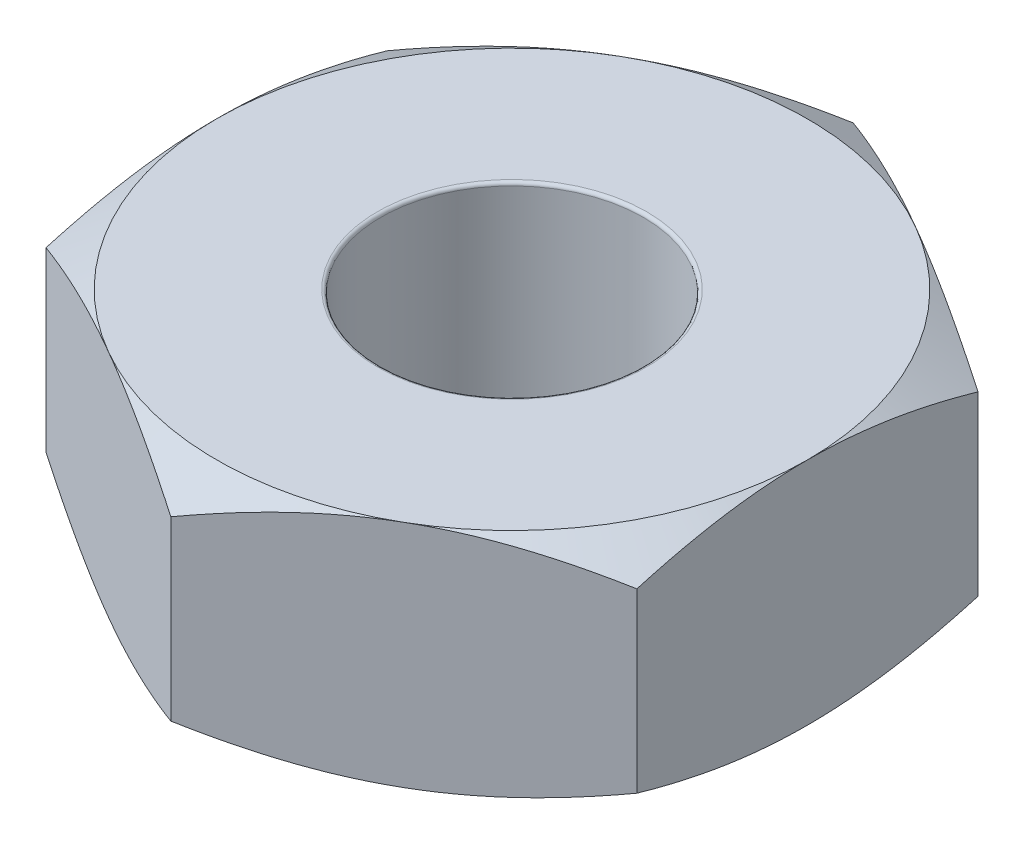
ISO-10303-21;
HEADER;
FILE_DESCRIPTION(('STEP AP214'),'2;1');
FILE_NAME('part.step','',(''),(''),'','','');
FILE_SCHEMA(('AUTOMOTIVE_DESIGN { 1 0 10303 214 1 1 1 1 }'));
ENDSEC;
DATA;
#1=APPLICATION_CONTEXT('core data for automotive mechanical design processes');
#2=APPLICATION_PROTOCOL_DEFINITION('international standard','automotive_design',2000,#1);
#3=PRODUCT_CONTEXT('',#1,'mechanical');
#4=PRODUCT('Part','Part','',(#3));
#5=PRODUCT_RELATED_PRODUCT_CATEGORY('part','',(#4));
#6=PRODUCT_DEFINITION_FORMATION('','',#4);
#7=PRODUCT_DEFINITION_CONTEXT('part definition',#1,'design');
#8=PRODUCT_DEFINITION('design','',#6,#7);
#9=PRODUCT_DEFINITION_SHAPE('','',#8);
#10=(LENGTH_UNIT() NAMED_UNIT(*) SI_UNIT(.MILLI.,.METRE.));
#11=(NAMED_UNIT(*) PLANE_ANGLE_UNIT() SI_UNIT($,.RADIAN.));
#12=(NAMED_UNIT(*) SI_UNIT($,.STERADIAN.) SOLID_ANGLE_UNIT());
#13=UNCERTAINTY_MEASURE_WITH_UNIT(LENGTH_MEASURE(1.E-05),#10,'distance_accuracy_value','');
#14=(GEOMETRIC_REPRESENTATION_CONTEXT(3) GLOBAL_UNCERTAINTY_ASSIGNED_CONTEXT((#13)) GLOBAL_UNIT_ASSIGNED_CONTEXT((#10,
#11,#12)) REPRESENTATION_CONTEXT('',''));
#15=CARTESIAN_POINT('',(0.,0.,0.));
#16=DIRECTION('',(0.,0.,1.));
#17=DIRECTION('',(1.,0.,0.));
#18=AXIS2_PLACEMENT_3D('',#15,#16,#17);
#19=CARTESIAN_POINT('',(0.,0.,0.));
#20=DIRECTION('',(0.,1.,0.));
#21=DIRECTION('',(0.,0.,1.));
#22=AXIS2_PLACEMENT_3D('',#19,#20,#21);
#23=PLANE('',#22);
#24=CARTESIAN_POINT('',(0.,0.,0.));
#25=DIRECTION('',(0.,1.,0.));
#26=DIRECTION('',(0.,0.,1.));
#27=AXIS2_PLACEMENT_3D('',#24,#25,#26);
#28=CIRCLE('',#27,1.025);
#29=CARTESIAN_POINT('',(0.,0.,1.025));
#30=VERTEX_POINT('',#29);
#31=EDGE_CURVE('E320',#30,#30,#28,.T.);
#32=ORIENTED_EDGE('',*,*,#31,.T.);
#33=EDGE_LOOP('',(#32));
#34=FACE_BOUND('',#33,.T.);
#35=CARTESIAN_POINT('',(0.,0.,0.));
#36=DIRECTION('',(0.,1.,0.));
#37=DIRECTION('',(0.,0.,1.));
#38=AXIS2_PLACEMENT_3D('',#35,#36,#37);
#39=CIRCLE('',#38,2.25);
#40=CARTESIAN_POINT('',(1.125,0.,1.94855715851499));
#41=VERTEX_POINT('',#40);
#42=CARTESIAN_POINT('',(-1.125,0.,1.94855715851499));
#43=VERTEX_POINT('',#42);
#44=EDGE_CURVE('E153',#41,#43,#39,.F.);
#45=ORIENTED_EDGE('',*,*,#44,.T.);
#46=CARTESIAN_POINT('',(-2.25,0.,0.));
#47=VERTEX_POINT('',#46);
#48=EDGE_CURVE('E61',#43,#47,#39,.F.);
#49=ORIENTED_EDGE('',*,*,#48,.T.);
#50=CARTESIAN_POINT('',(-1.125,0.,-1.94855715851499));
#51=VERTEX_POINT('',#50);
#52=EDGE_CURVE('E399',#47,#51,#39,.F.);
#53=ORIENTED_EDGE('',*,*,#52,.T.);
#54=CARTESIAN_POINT('',(1.125,0.,-1.94855715851499));
#55=VERTEX_POINT('',#54);
#56=EDGE_CURVE('E395',#51,#55,#39,.F.);
#57=ORIENTED_EDGE('',*,*,#56,.T.);
#58=CARTESIAN_POINT('',(2.25,0.,0.));
#59=VERTEX_POINT('',#58);
#60=EDGE_CURVE('E160',#55,#59,#39,.F.);
#61=ORIENTED_EDGE('',*,*,#60,.T.);
#62=CARTESIAN_POINT('',(0.,0.,0.));
#63=DIRECTION('',(0.,1.,0.));
#64=DIRECTION('',(0.,0.,1.));
#65=AXIS2_PLACEMENT_3D('',#62,#63,#64);
#66=CIRCLE('',#65,2.25);
#67=EDGE_CURVE('E140',#41,#59,#66,.T.);
#68=ORIENTED_EDGE('',*,*,#67,.F.);
#69=EDGE_LOOP('',(#45,#49,#53,#57,#61,#68));
#70=FACE_BOUND('',#69,.T.);
#71=ADVANCED_FACE('F45',(#34,#70),#23,.F.);
#72=CARTESIAN_POINT('',(0.,1.75,0.));
#73=DIRECTION('',(0.,1.,0.));
#74=DIRECTION('',(0.,0.,1.));
#75=AXIS2_PLACEMENT_3D('',#72,#73,#74);
#76=PLANE('',#75);
#77=CARTESIAN_POINT('',(0.,1.75,0.));
#78=DIRECTION('',(0.,1.,0.));
#79=DIRECTION('',(0.,0.,1.));
#80=AXIS2_PLACEMENT_3D('',#77,#78,#79);
#81=CIRCLE('',#80,1.025);
#82=CARTESIAN_POINT('',(0.,1.75,1.025));
#83=VERTEX_POINT('',#82);
#84=EDGE_CURVE('E12',#83,#83,#81,.F.);
#85=ORIENTED_EDGE('',*,*,#84,.T.);
#86=EDGE_LOOP('',(#85));
#87=FACE_BOUND('',#86,.T.);
#88=CARTESIAN_POINT('',(0.,1.75,0.));
#89=DIRECTION('',(0.,1.,0.));
#90=DIRECTION('',(0.,0.,1.));
#91=AXIS2_PLACEMENT_3D('',#88,#89,#90);
#92=CIRCLE('',#91,2.25);
#93=CARTESIAN_POINT('',(-1.125,1.75,1.94855715851499));
#94=VERTEX_POINT('',#93);
#95=CARTESIAN_POINT('',(1.125,1.75,1.94855715851499));
#96=VERTEX_POINT('',#95);
#97=EDGE_CURVE('E403',#94,#96,#92,.T.);
#98=ORIENTED_EDGE('',*,*,#97,.T.);
#99=CARTESIAN_POINT('',(2.25,1.75,0.));
#100=VERTEX_POINT('',#99);
#101=EDGE_CURVE('E408',#96,#100,#92,.T.);
#102=ORIENTED_EDGE('',*,*,#101,.T.);
#103=CARTESIAN_POINT('',(1.125,1.75,-1.94855715851499));
#104=VERTEX_POINT('',#103);
#105=EDGE_CURVE('E389',#100,#104,#92,.T.);
#106=ORIENTED_EDGE('',*,*,#105,.T.);
#107=CARTESIAN_POINT('',(-1.125,1.75,-1.94855715851499));
#108=VERTEX_POINT('',#107);
#109=EDGE_CURVE('E359',#104,#108,#92,.T.);
#110=ORIENTED_EDGE('',*,*,#109,.T.);
#111=CARTESIAN_POINT('',(-2.25,1.75,0.));
#112=VERTEX_POINT('',#111);
#113=EDGE_CURVE('E437',#108,#112,#92,.T.);
#114=ORIENTED_EDGE('',*,*,#113,.T.);
#115=EDGE_CURVE('E407',#112,#94,#92,.T.);
#116=ORIENTED_EDGE('',*,*,#115,.T.);
#117=EDGE_LOOP('',(#98,#102,#106,#110,#114,#116));
#118=FACE_BOUND('',#117,.T.);
#119=ADVANCED_FACE('F279',(#87,#118),#76,.T.);
#120=CARTESIAN_POINT('',(2.25,1.75,-1.29903810567666));
#121=DIRECTION('',(-0.5,0.,0.866025403784439));
#122=DIRECTION('',(0.866025403784439,0.,0.5));
#123=AXIS2_PLACEMENT_3D('',#120,#121,#122);
#124=PLANE('',#123);
#125=DIRECTION('',(0.,-1.,0.));
#126=VECTOR('',#125,1.);
#127=CARTESIAN_POINT('',(2.25,1.75,-1.29903810567666));
#128=LINE('',#127,#126);
#129=CARTESIAN_POINT('',(2.25,1.54903810567666,-1.29903810567667));
#130=VERTEX_POINT('',#129);
#131=CARTESIAN_POINT('',(2.25,0.200961894323341,-1.29903810567666));
#132=VERTEX_POINT('',#131);
#133=EDGE_CURVE('E274',#130,#132,#128,.T.);
#134=ORIENTED_EDGE('',*,*,#133,.T.);
#135=CARTESIAN_POINT('',(2.2502,0.201028565434254,-1.29892263562282));
#136=CARTESIAN_POINT('',(2.15132275118564,0.168055578047864,-1.35600944184252));
#137=CARTESIAN_POINT('',(2.05159200282091,0.138067535415598,-1.41358901625738));
#138=CARTESIAN_POINT('',(1.85040345977937,0.0857223882308779,-1.52974527574028));
#139=CARTESIAN_POINT('',(1.74894208949705,0.0633838027064785,-1.58832402518513));
#140=CARTESIAN_POINT('',(1.54727681019892,0.0286095576734187,-1.7047555284741));
#141=CARTESIAN_POINT('',(1.44710393502333,0.0159424738337182,-1.76259036492223));
#142=CARTESIAN_POINT('',(1.24628668739732,0.000818907417418695,-1.87853225689702));
#143=CARTESIAN_POINT('',(1.1456430451668,-0.00165009697600181,-1.93663889083104));
#144=CARTESIAN_POINT('',(0.957574835473434,0.00347837463602911,-2.04522012232352));
#145=CARTESIAN_POINT('',(0.870122156108741,0.00981663451512032,-2.09571095029608));
#146=CARTESIAN_POINT('',(0.695786567891226,0.0299076571898891,-2.19636364908279));
#147=CARTESIAN_POINT('',(0.608904262311712,0.0436672872310835,-2.24652517159694));
#148=CARTESIAN_POINT('',(0.434209045898264,0.0780662653506653,-2.34738550181938));
#149=CARTESIAN_POINT('',(0.346418252564746,0.0988514715826553,-2.39807153998286));
#150=CARTESIAN_POINT('',(0.172146263122405,0.146026087362979,-2.49868751999961));
#151=CARTESIAN_POINT('',(0.0856628332489975,0.172404408014302,-2.54861875151746));
#152=CARTESIAN_POINT('',(-0.000200000000000256,0.201028565434254,-2.59819168140715));
#153=B_SPLINE_CURVE_WITH_KNOTS('',3,(#135,#136,#137,#138,#139,#140,#141,#142,#143,#144,#145,
#146,#147,#148,#149,#150,#151,#152),.UNSPECIFIED.,.F.,.F.,(4,2,2,2,2,2,2,2,4),(0.,
0.356658826016552,0.714175103224236,1.06284241804968,1.41108149062516,1.71433394539794,
2.01786749258222,2.32813511279245,2.63779325460359),.UNSPECIFIED.);
#154=EDGE_CURVE('E69',#132,#55,#153,.T.);
#155=ORIENTED_EDGE('',*,*,#154,.T.);
#156=CARTESIAN_POINT('',(0.,0.200961894323341,-2.59807621135332));
#157=VERTEX_POINT('',#156);
#158=EDGE_CURVE('E206',#55,#157,#153,.T.);
#159=ORIENTED_EDGE('',*,*,#158,.T.);
#160=DIRECTION('',(0.,-1.,0.));
#161=VECTOR('',#160,1.);
#162=CARTESIAN_POINT('',(0.,1.75,-2.59807621135332));
#163=LINE('',#162,#161);
#164=CARTESIAN_POINT('',(0.,1.54903810567666,-2.59807621135332));
#165=VERTEX_POINT('',#164);
#166=EDGE_CURVE('E317',#165,#157,#163,.T.);
#167=ORIENTED_EDGE('',*,*,#166,.F.);
#168=CARTESIAN_POINT('',(2.2502,1.54897143456575,-1.29892263562282));
#169=CARTESIAN_POINT('',(2.15132275118564,1.58194442195214,-1.35600944184252));
#170=CARTESIAN_POINT('',(2.05159200282091,1.6119324645844,-1.41358901625738));
#171=CARTESIAN_POINT('',(1.85040345977937,1.66427761176912,-1.52974527574028));
#172=CARTESIAN_POINT('',(1.74894208949705,1.68661619729352,-1.58832402518513));
#173=CARTESIAN_POINT('',(1.54727681019892,1.72139044232658,-1.7047555284741));
#174=CARTESIAN_POINT('',(1.44710393502333,1.73405752616628,-1.76259036492223));
#175=CARTESIAN_POINT('',(1.24628668739732,1.74918109258258,-1.87853225689702));
#176=CARTESIAN_POINT('',(1.1456430451668,1.751650096976,-1.93663889083104));
#177=CARTESIAN_POINT('',(0.957574835473434,1.74652162536397,-2.04522012232352));
#178=CARTESIAN_POINT('',(0.870122156108742,1.74018336548488,-2.09571095029608));
#179=CARTESIAN_POINT('',(0.695786567891226,1.72009234281011,-2.19636364908279));
#180=CARTESIAN_POINT('',(0.608904262311712,1.70633271276892,-2.24652517159694));
#181=CARTESIAN_POINT('',(0.434209045898264,1.67193373464933,-2.34738550181938));
#182=CARTESIAN_POINT('',(0.346418252564746,1.65114852841734,-2.39807153998286));
#183=CARTESIAN_POINT('',(0.172146263122405,1.60397391263702,-2.49868751999961));
#184=CARTESIAN_POINT('',(0.0856628332489977,1.5775955919857,-2.54861875151746));
#185=CARTESIAN_POINT('',(-0.00020000000000026,1.54897143456575,-2.59819168140715));
#186=B_SPLINE_CURVE_WITH_KNOTS('',3,(#168,#169,#170,#171,#172,#173,#174,#175,#176,#177,#178,
#179,#180,#181,#182,#183,#184,#185),.UNSPECIFIED.,.F.,.F.,(4,2,2,2,2,2,2,2,4),(0.,
0.356658826016552,0.714175103224236,1.06284241804968,1.41108149062516,1.71433394539794,
2.01786749258222,2.32813511279245,2.63779325460359),.UNSPECIFIED.);
#187=EDGE_CURVE('E266',#104,#165,#186,.T.);
#188=ORIENTED_EDGE('',*,*,#187,.F.);
#189=EDGE_CURVE('E273',#130,#104,#186,.T.);
#190=ORIENTED_EDGE('',*,*,#189,.F.);
#191=EDGE_LOOP('',(#134,#155,#159,#167,#188,#190));
#192=FACE_BOUND('',#191,.T.);
#193=ADVANCED_FACE('F276',(#192),#124,.F.);
#194=CARTESIAN_POINT('',(0.,1.75,-2.59807621135332));
#195=DIRECTION('',(0.5,0.,0.866025403784439));
#196=DIRECTION('',(0.866025403784439,0.,-0.5));
#197=AXIS2_PLACEMENT_3D('',#194,#195,#196);
#198=PLANE('',#197);
#199=ORIENTED_EDGE('',*,*,#166,.T.);
#200=CARTESIAN_POINT('',(0.000199999999999657,0.201028565434254,-2.59819168140715));
#201=CARTESIAN_POINT('',(-0.0986772488143576,0.168055578047863,-2.54110487518745));
#202=CARTESIAN_POINT('',(-0.198407997179094,0.138067535415598,-2.48352530077259));
#203=CARTESIAN_POINT('',(-0.399596540220633,0.0857223882308776,-2.36736904128969));
#204=CARTESIAN_POINT('',(-0.501057910502946,0.0633838027064784,-2.30879029184485));
#205=CARTESIAN_POINT('',(-0.702723189801079,0.0286095576734188,-2.19235878855587));
#206=CARTESIAN_POINT('',(-0.802896064976672,0.0159424738337184,-2.13452395210774));
#207=CARTESIAN_POINT('',(-1.00371331260268,0.000818907417418941,-2.01858206013295));
#208=CARTESIAN_POINT('',(-1.1043569548332,-0.00165009697600152,-1.96047542619893));
#209=CARTESIAN_POINT('',(-1.29242516452657,0.00347837463602921,-1.85189419470646));
#210=CARTESIAN_POINT('',(-1.37987784389126,0.00981663451512025,-1.8014033667339));
#211=CARTESIAN_POINT('',(-1.55421343210877,0.0299076571898891,-1.70075066794718));
#212=CARTESIAN_POINT('',(-1.64109573768829,0.0436672872310837,-1.65058914543304));
#213=CARTESIAN_POINT('',(-1.81579095410174,0.0780662653506656,-1.54972881521059));
#214=CARTESIAN_POINT('',(-1.90358174743525,0.0988514715826555,-1.49904277704711));
#215=CARTESIAN_POINT('',(-2.0778537368776,0.146026087362979,-1.39842679703037));
#216=CARTESIAN_POINT('',(-2.164337166751,0.172404408014302,-1.34849556551251));
#217=CARTESIAN_POINT('',(-2.2502,0.201028565434255,-1.29892263562282));
#218=B_SPLINE_CURVE_WITH_KNOTS('',3,(#200,#201,#202,#203,#204,#205,#206,#207,#208,#209,#210,
#211,#212,#213,#214,#215,#216,#217),.UNSPECIFIED.,.F.,.F.,(4,2,2,2,2,2,2,2,4),(0.,
0.356658826016552,0.714175103224236,1.06284241804968,1.41108149062516,1.71433394539794,
2.01786749258222,2.32813511279245,2.63779325460359),.UNSPECIFIED.);
#219=EDGE_CURVE('E409',#157,#51,#218,.T.);
#220=ORIENTED_EDGE('',*,*,#219,.T.);
#221=CARTESIAN_POINT('',(-2.25,0.200961894323341,-1.29903810567666));
#222=VERTEX_POINT('',#221);
#223=EDGE_CURVE('E226',#51,#222,#218,.T.);
#224=ORIENTED_EDGE('',*,*,#223,.T.);
#225=DIRECTION('',(0.,-1.,0.));
#226=VECTOR('',#225,1.);
#227=CARTESIAN_POINT('',(-2.25,1.75,-1.29903810567666));
#228=LINE('',#227,#226);
#229=CARTESIAN_POINT('',(-2.25,1.54903810567666,-1.29903810567666));
#230=VERTEX_POINT('',#229);
#231=EDGE_CURVE('E371',#230,#222,#228,.T.);
#232=ORIENTED_EDGE('',*,*,#231,.F.);
#233=CARTESIAN_POINT('',(0.00019999999999965,1.54897143456575,-2.59819168140715));
#234=CARTESIAN_POINT('',(-0.0986772488143576,1.58194442195214,-2.54110487518745));
#235=CARTESIAN_POINT('',(-0.198407997179094,1.6119324645844,-2.48352530077259));
#236=CARTESIAN_POINT('',(-0.399596540220633,1.66427761176912,-2.36736904128969));
#237=CARTESIAN_POINT('',(-0.501057910502946,1.68661619729352,-2.30879029184485));
#238=CARTESIAN_POINT('',(-0.702723189801079,1.72139044232658,-2.19235878855587));
#239=CARTESIAN_POINT('',(-0.802896064976672,1.73405752616628,-2.13452395210774));
#240=CARTESIAN_POINT('',(-1.00371331260268,1.74918109258258,-2.01858206013295));
#241=CARTESIAN_POINT('',(-1.1043569548332,1.751650096976,-1.96047542619893));
#242=CARTESIAN_POINT('',(-1.29242516452657,1.74652162536397,-1.85189419470646));
#243=CARTESIAN_POINT('',(-1.37987784389126,1.74018336548488,-1.8014033667339));
#244=CARTESIAN_POINT('',(-1.55421343210877,1.72009234281011,-1.70075066794718));
#245=CARTESIAN_POINT('',(-1.64109573768829,1.70633271276892,-1.65058914543304));
#246=CARTESIAN_POINT('',(-1.81579095410174,1.67193373464933,-1.54972881521059));
#247=CARTESIAN_POINT('',(-1.90358174743525,1.65114852841734,-1.49904277704711));
#248=CARTESIAN_POINT('',(-2.0778537368776,1.60397391263702,-1.39842679703037));
#249=CARTESIAN_POINT('',(-2.164337166751,1.5775955919857,-1.34849556551251));
#250=CARTESIAN_POINT('',(-2.2502,1.54897143456575,-1.29892263562282));
#251=B_SPLINE_CURVE_WITH_KNOTS('',3,(#233,#234,#235,#236,#237,#238,#239,#240,#241,#242,#243,
#244,#245,#246,#247,#248,#249,#250),.UNSPECIFIED.,.F.,.F.,(4,2,2,2,2,2,2,2,4),(0.,
0.356658826016552,0.714175103224236,1.06284241804968,1.41108149062516,1.71433394539794,
2.01786749258222,2.32813511279245,2.63779325460359),.UNSPECIFIED.);
#252=EDGE_CURVE('E258',#108,#230,#251,.T.);
#253=ORIENTED_EDGE('',*,*,#252,.F.);
#254=EDGE_CURVE('E265',#165,#108,#251,.T.);
#255=ORIENTED_EDGE('',*,*,#254,.F.);
#256=EDGE_LOOP('',(#199,#220,#224,#232,#253,#255));
#257=FACE_BOUND('',#256,.T.);
#258=ADVANCED_FACE('F236',(#257),#198,.F.);
#259=CARTESIAN_POINT('',(-2.25,1.75,-1.29903810567666));
#260=DIRECTION('',(1.,0.,0.));
#261=DIRECTION('',(0.,0.,-1.));
#262=AXIS2_PLACEMENT_3D('',#259,#260,#261);
#263=PLANE('',#262);
#264=ORIENTED_EDGE('',*,*,#231,.T.);
#265=CARTESIAN_POINT('',(-2.25,1.56555831138049,-4.42213047046896));
#266=CARTESIAN_POINT('',(-2.25,1.51253641089187,-4.31907609605376));
#267=CARTESIAN_POINT('',(-2.25,1.45980461522268,-4.21587114895434));
#268=CARTESIAN_POINT('',(-2.25,1.35506687206804,-4.00909136564838));
#269=CARTESIAN_POINT('',(-2.25,1.30306093826251,-3.90551652251669));
#270=CARTESIAN_POINT('',(-2.25,1.19983819414006,-3.69776226755876));
#271=CARTESIAN_POINT('',(-2.25,1.14862281407765,-3.59358214386061));
#272=CARTESIAN_POINT('',(-2.25,1.04726863927474,-3.38469686395628));
#273=CARTESIAN_POINT('',(-2.25,0.99712985988396,-3.27999170029052));
#274=CARTESIAN_POINT('',(-2.25,0.895590975392253,-3.0644377366485));
#275=CARTESIAN_POINT('',(-2.25,0.844262813896654,-2.95355495083985));
#276=CARTESIAN_POINT('',(-2.25,0.743488704008481,-2.73093810810307));
#277=CARTESIAN_POINT('',(-2.25,0.694042704613714,-2.61920407434039));
#278=CARTESIAN_POINT('',(-2.25,0.59760651738062,-2.39476559407176));
#279=CARTESIAN_POINT('',(-2.25,0.550614681662905,-2.28206185948415));
#280=CARTESIAN_POINT('',(-2.25,0.45977996323087,-2.05535508627361));
#281=CARTESIAN_POINT('',(-2.25,0.415937817282043,-1.94135175083154));
#282=CARTESIAN_POINT('',(-2.25,0.325629065729292,-1.69318584033385));
#283=CARTESIAN_POINT('',(-2.25,0.279891243493501,-1.55875423344574));
#284=CARTESIAN_POINT('',(-2.25,0.196186335346582,-1.28751781965287));
#285=CARTESIAN_POINT('',(-2.25,0.158215303092898,-1.15071425647396));
#286=CARTESIAN_POINT('',(-2.25,0.0934100246854136,-0.877191892519573));
#287=CARTESIAN_POINT('',(-2.25,0.0663767276583868,-0.740521481245887));
#288=CARTESIAN_POINT('',(-2.25,0.0252694807344894,-0.465223193243967));
#289=CARTESIAN_POINT('',(-2.25,0.0111879530299647,-0.326596509361762));
#290=CARTESIAN_POINT('',(-2.25,0.00112514059449651,-0.117223951792121));
#291=CARTESIAN_POINT('',(-2.25,-0.000357653579398792,-0.0467155663666306));
#292=CARTESIAN_POINT('',(-2.25,0.000502767822567261,0.0942778450423104));
#293=CARTESIAN_POINT('',(-2.25,0.00284598504344027,0.164762871015704));
#294=CARTESIAN_POINT('',(-2.25,0.0155320953718864,0.375901114139418));
#295=CARTESIAN_POINT('',(-2.25,0.0315313215434619,0.516240180351078));
#296=CARTESIAN_POINT('',(-2.25,0.0769275866035952,0.797536431240902));
#297=CARTESIAN_POINT('',(-2.25,0.106589144783227,0.9384486746695));
#298=CARTESIAN_POINT('',(-2.25,0.176240629866024,1.21767236088611));
#299=CARTESIAN_POINT('',(-2.25,0.21623367827223,1.35598300406735));
#300=CARTESIAN_POINT('',(-2.25,0.301848870671622,1.62417819674141));
#301=CARTESIAN_POINT('',(-2.25,0.347149960587631,1.75416736002763));
#302=CARTESIAN_POINT('',(-2.25,0.442801523101071,2.01228919589808));
#303=CARTESIAN_POINT('',(-2.25,0.493153199709669,2.14042141743363));
#304=CARTESIAN_POINT('',(-2.25,0.597611255264981,2.39528540480934));
#305=CARTESIAN_POINT('',(-2.25,0.651721394221921,2.52201561679053));
#306=CARTESIAN_POINT('',(-2.25,0.762705830640598,2.77426151692868));
#307=CARTESIAN_POINT('',(-2.25,0.819580277044825,2.89977713920496));
#308=CARTESIAN_POINT('',(-2.25,0.932150499113663,3.14277870156182));
#309=CARTESIAN_POINT('',(-2.25,0.987731600848741,3.26031797968369));
#310=CARTESIAN_POINT('',(-2.25,1.10035122751633,3.49469938792213));
#311=CARTESIAN_POINT('',(-2.25,1.15738979940018,3.61154149542992));
#312=CARTESIAN_POINT('',(-2.25,1.27243073348915,3.84427750639044));
#313=CARTESIAN_POINT('',(-2.25,1.33042936901701,3.96017325620989));
#314=CARTESIAN_POINT('',(-2.25,1.44735195230743,4.19148501960206));
#315=CARTESIAN_POINT('',(-2.25,1.5062758208671,4.30690107318009));
#316=CARTESIAN_POINT('',(-2.25,1.56555831138049,4.42213047046896));
#317=B_SPLINE_CURVE_WITH_KNOTS('',3,(#265,#266,#267,#268,#269,#270,#271,#272,#273,#274,#275,
#276,#277,#278,#279,#280,#281,#282,#283,#284,#285,#286,#287,#288,#289,#290,#291,#292,#293,#294,
#295,#296,#297,#298,#299,#300,#301,#302,#303,#304,#305,#306,#307,#308,#309,#310,#311,#312,#313,
#314,#315,#316),.UNSPECIFIED.,.F.,.F.,(4,2,2,2,2,2,2,2,2,2,2,2,2,2,2,2,2,2,2,2,2,2,2,2,2,4),(0.,
0.347684660648866,0.69537586509188,1.04363591220691,1.39190092137216,1.75844707629515,
2.12498329159302,2.4912701408257,2.85764239361152,3.28347290105065,3.70908650157083,
4.12656251242164,4.54379411118024,4.75527202620087,4.96675003214744,5.38969802732589,
5.82120323135264,6.25283896092085,6.66567429964863,7.07860828930034,7.49196150428248,
7.90533701571904,8.29537955819919,8.68543468149341,9.07422449696778,9.46298121030578),.UNSPECIFIED.);
#318=EDGE_CURVE('E225',#222,#47,#317,.T.);
#319=ORIENTED_EDGE('',*,*,#318,.T.);
#320=CARTESIAN_POINT('',(-2.25,0.200961894323341,1.29903810567666));
#321=VERTEX_POINT('',#320);
#322=EDGE_CURVE('E217',#47,#321,#317,.T.);
#323=ORIENTED_EDGE('',*,*,#322,.T.);
#324=DIRECTION('',(0.,-1.,0.));
#325=VECTOR('',#324,1.);
#326=CARTESIAN_POINT('',(-2.25,1.75,1.29903810567666));
#327=LINE('',#326,#325);
#328=CARTESIAN_POINT('',(-2.25,1.54903810567666,1.29903810567666));
#329=VERTEX_POINT('',#328);
#330=EDGE_CURVE('E374',#329,#321,#327,.T.);
#331=ORIENTED_EDGE('',*,*,#330,.F.);
#332=CARTESIAN_POINT('',(-2.25,0.184441688619512,-4.42213047046896));
#333=CARTESIAN_POINT('',(-2.25,0.237463589108126,-4.31907609605376));
#334=CARTESIAN_POINT('',(-2.25,0.29019538477732,-4.21587114895434));
#335=CARTESIAN_POINT('',(-2.25,0.39493312793196,-4.00909136564838));
#336=CARTESIAN_POINT('',(-2.25,0.446939061737494,-3.90551652251669));
#337=CARTESIAN_POINT('',(-2.25,0.550161805859938,-3.69776226755876));
#338=CARTESIAN_POINT('',(-2.25,0.601377185922349,-3.59358214386061));
#339=CARTESIAN_POINT('',(-2.25,0.702731360725256,-3.38469686395628));
#340=CARTESIAN_POINT('',(-2.25,0.75287014011604,-3.27999170029052));
#341=CARTESIAN_POINT('',(-2.25,0.854409024607747,-3.0644377366485));
#342=CARTESIAN_POINT('',(-2.25,0.905737186103346,-2.95355495083985));
#343=CARTESIAN_POINT('',(-2.25,1.00651129599152,-2.73093810810307));
#344=CARTESIAN_POINT('',(-2.25,1.05595729538629,-2.61920407434039));
#345=CARTESIAN_POINT('',(-2.25,1.15239348261938,-2.39476559407176));
#346=CARTESIAN_POINT('',(-2.25,1.1993853183371,-2.28206185948415));
#347=CARTESIAN_POINT('',(-2.25,1.29022003676913,-2.05535508627361));
#348=CARTESIAN_POINT('',(-2.25,1.33406218271796,-1.94135175083154));
#349=CARTESIAN_POINT('',(-2.25,1.42437093427071,-1.69318584033385));
#350=CARTESIAN_POINT('',(-2.25,1.4701087565065,-1.55875423344574));
#351=CARTESIAN_POINT('',(-2.25,1.55381366465342,-1.28751781965287));
#352=CARTESIAN_POINT('',(-2.25,1.5917846969071,-1.15071425647396));
#353=CARTESIAN_POINT('',(-2.25,1.65658997531459,-0.877191892519573));
#354=CARTESIAN_POINT('',(-2.25,1.68362327234161,-0.740521481245887));
#355=CARTESIAN_POINT('',(-2.25,1.72473051926551,-0.465223193243967));
#356=CARTESIAN_POINT('',(-2.25,1.73881204697004,-0.326596509361762));
#357=CARTESIAN_POINT('',(-2.25,1.7488748594055,-0.117223951792121));
#358=CARTESIAN_POINT('',(-2.25,1.7503576535794,-0.0467155663666307));
#359=CARTESIAN_POINT('',(-2.25,1.74949723217743,0.0942778450423104));
#360=CARTESIAN_POINT('',(-2.25,1.74715401495656,0.164762871015704));
#361=CARTESIAN_POINT('',(-2.25,1.73446790462811,0.375901114139418));
#362=CARTESIAN_POINT('',(-2.25,1.71846867845654,0.516240180351078));
#363=CARTESIAN_POINT('',(-2.25,1.6730724133964,0.797536431240902));
#364=CARTESIAN_POINT('',(-2.25,1.64341085521677,0.938448674669501));
#365=CARTESIAN_POINT('',(-2.25,1.57375937013398,1.21767236088611));
#366=CARTESIAN_POINT('',(-2.25,1.53376632172777,1.35598300406735));
#367=CARTESIAN_POINT('',(-2.25,1.44815112932838,1.62417819674141));
#368=CARTESIAN_POINT('',(-2.25,1.40285003941237,1.75416736002763));
#369=CARTESIAN_POINT('',(-2.25,1.30719847689893,2.01228919589808));
#370=CARTESIAN_POINT('',(-2.25,1.25684680029033,2.14042141743363));
#371=CARTESIAN_POINT('',(-2.25,1.15238874473502,2.39528540480934));
#372=CARTESIAN_POINT('',(-2.25,1.09827860577808,2.52201561679053));
#373=CARTESIAN_POINT('',(-2.25,0.987294169359402,2.77426151692868));
#374=CARTESIAN_POINT('',(-2.25,0.930419722955176,2.89977713920496));
#375=CARTESIAN_POINT('',(-2.25,0.817849500886337,3.14277870156182));
#376=CARTESIAN_POINT('',(-2.25,0.762268399151259,3.26031797968369));
#377=CARTESIAN_POINT('',(-2.25,0.649648772483666,3.49469938792213));
#378=CARTESIAN_POINT('',(-2.25,0.592610200599822,3.61154149542992));
#379=CARTESIAN_POINT('',(-2.25,0.477569266510855,3.84427750639044));
#380=CARTESIAN_POINT('',(-2.25,0.419570630982988,3.96017325620988));
#381=CARTESIAN_POINT('',(-2.25,0.302648047692571,4.19148501960205));
#382=CARTESIAN_POINT('',(-2.25,0.243724179132899,4.30690107318009));
#383=CARTESIAN_POINT('',(-2.25,0.184441688619512,4.42213047046896));
#384=B_SPLINE_CURVE_WITH_KNOTS('',3,(#332,#333,#334,#335,#336,#337,#338,#339,#340,#341,#342,
#343,#344,#345,#346,#347,#348,#349,#350,#351,#352,#353,#354,#355,#356,#357,#358,#359,#360,#361,
#362,#363,#364,#365,#366,#367,#368,#369,#370,#371,#372,#373,#374,#375,#376,#377,#378,#379,#380,
#381,#382,#383),.UNSPECIFIED.,.F.,.F.,(4,2,2,2,2,2,2,2,2,2,2,2,2,2,2,2,2,2,2,2,2,2,2,2,2,4),(0.,
0.347684660648866,0.69537586509188,1.04363591220691,1.39190092137216,1.75844707629515,
2.12498329159302,2.4912701408257,2.85764239361152,3.28347290105065,3.70908650157083,
4.12656251242164,4.54379411118024,4.75527202620087,4.96675003214744,5.38969802732589,
5.82120323135264,6.25283896092085,6.66567429964863,7.07860828930034,7.49196150428248,
7.90533701571904,8.29537955819919,8.68543468149341,9.07422449696778,9.46298121030578),.UNSPECIFIED.);
#385=EDGE_CURVE('E242',#112,#329,#384,.T.);
#386=ORIENTED_EDGE('',*,*,#385,.F.);
#387=EDGE_CURVE('E250',#230,#112,#384,.T.);
#388=ORIENTED_EDGE('',*,*,#387,.F.);
#389=EDGE_LOOP('',(#264,#319,#323,#331,#386,#388));
#390=FACE_BOUND('',#389,.T.);
#391=ADVANCED_FACE('F232',(#390),#263,.F.);
#392=CARTESIAN_POINT('',(-2.25,1.75,1.29903810567666));
#393=DIRECTION('',(0.5,0.,-0.866025403784439));
#394=DIRECTION('',(-0.866025403784439,0.,-0.5));
#395=AXIS2_PLACEMENT_3D('',#392,#393,#394);
#396=PLANE('',#395);
#397=ORIENTED_EDGE('',*,*,#330,.T.);
#398=CARTESIAN_POINT('',(-2.2502,0.201028565434254,1.29892263562282));
#399=CARTESIAN_POINT('',(-2.15132275118564,0.168055578047864,1.35600944184252));
#400=CARTESIAN_POINT('',(-2.05159200282091,0.138067535415598,1.41358901625738));
#401=CARTESIAN_POINT('',(-1.85040345977937,0.0857223882308778,1.52974527574028));
#402=CARTESIAN_POINT('',(-1.74894208949705,0.0633838027064785,1.58832402518512));
#403=CARTESIAN_POINT('',(-1.54727681019892,0.0286095576734187,1.7047555284741));
#404=CARTESIAN_POINT('',(-1.44710393502333,0.0159424738337182,1.76259036492223));
#405=CARTESIAN_POINT('',(-1.24628668739732,0.000818907417418666,1.87853225689702));
#406=CARTESIAN_POINT('',(-1.1456430451668,-0.00165009697600177,1.93663889083104));
#407=CARTESIAN_POINT('',(-0.957574835473435,0.00347837463602908,2.04522012232352));
#408=CARTESIAN_POINT('',(-0.870122156108742,0.00981663451512018,2.09571095029608));
#409=CARTESIAN_POINT('',(-0.695786567891226,0.0299076571898889,2.19636364908279));
#410=CARTESIAN_POINT('',(-0.608904262311712,0.0436672872310833,2.24652517159694));
#411=CARTESIAN_POINT('',(-0.434209045898264,0.0780662653506651,2.34738550181938));
#412=CARTESIAN_POINT('',(-0.346418252564747,0.0988514715826551,2.39807153998286));
#413=CARTESIAN_POINT('',(-0.172146263122405,0.146026087362979,2.49868751999961));
#414=CARTESIAN_POINT('',(-0.0856628332489977,0.172404408014302,2.54861875151746));
#415=CARTESIAN_POINT('',(0.000199999999999941,0.201028565434254,2.59819168140715));
#416=B_SPLINE_CURVE_WITH_KNOTS('',3,(#398,#399,#400,#401,#402,#403,#404,#405,#406,#407,#408,
#409,#410,#411,#412,#413,#414,#415),.UNSPECIFIED.,.F.,.F.,(4,2,2,2,2,2,2,2,4),(0.,
0.356658826016552,0.714175103224236,1.06284241804968,1.41108149062516,1.71433394539794,
2.01786749258222,2.32813511279245,2.63779325460359),.UNSPECIFIED.);
#417=EDGE_CURVE('E174',#321,#43,#416,.T.);
#418=ORIENTED_EDGE('',*,*,#417,.T.);
#419=CARTESIAN_POINT('',(0.,0.200961894323341,2.59807621135332));
#420=VERTEX_POINT('',#419);
#421=EDGE_CURVE('E156',#43,#420,#416,.T.);
#422=ORIENTED_EDGE('',*,*,#421,.T.);
#423=DIRECTION('',(0.,-1.,0.));
#424=VECTOR('',#423,1.);
#425=CARTESIAN_POINT('',(0.,1.75,2.59807621135332));
#426=LINE('',#425,#424);
#427=CARTESIAN_POINT('',(0.,1.54903810567666,2.59807621135332));
#428=VERTEX_POINT('',#427);
#429=EDGE_CURVE('E171',#428,#420,#426,.T.);
#430=ORIENTED_EDGE('',*,*,#429,.F.);
#431=CARTESIAN_POINT('',(-2.2502,1.54897143456575,1.29892263562282));
#432=CARTESIAN_POINT('',(-2.15132275118564,1.58194442195214,1.35600944184252));
#433=CARTESIAN_POINT('',(-2.05159200282091,1.6119324645844,1.41358901625738));
#434=CARTESIAN_POINT('',(-1.85040345977937,1.66427761176912,1.52974527574028));
#435=CARTESIAN_POINT('',(-1.74894208949705,1.68661619729352,1.58832402518513));
#436=CARTESIAN_POINT('',(-1.54727681019892,1.72139044232658,1.7047555284741));
#437=CARTESIAN_POINT('',(-1.44710393502333,1.73405752616628,1.76259036492223));
#438=CARTESIAN_POINT('',(-1.24628668739732,1.74918109258258,1.87853225689702));
#439=CARTESIAN_POINT('',(-1.1456430451668,1.751650096976,1.93663889083104));
#440=CARTESIAN_POINT('',(-0.957574835473435,1.74652162536397,2.04522012232352));
#441=CARTESIAN_POINT('',(-0.870122156108742,1.74018336548488,2.09571095029608));
#442=CARTESIAN_POINT('',(-0.695786567891226,1.72009234281011,2.19636364908279));
#443=CARTESIAN_POINT('',(-0.608904262311712,1.70633271276892,2.24652517159694));
#444=CARTESIAN_POINT('',(-0.434209045898264,1.67193373464933,2.34738550181938));
#445=CARTESIAN_POINT('',(-0.346418252564746,1.65114852841734,2.39807153998286));
#446=CARTESIAN_POINT('',(-0.172146263122405,1.60397391263702,2.49868751999961));
#447=CARTESIAN_POINT('',(-0.0856628332489978,1.5775955919857,2.54861875151746));
#448=CARTESIAN_POINT('',(0.000199999999999937,1.54897143456575,2.59819168140715));
#449=B_SPLINE_CURVE_WITH_KNOTS('',3,(#431,#432,#433,#434,#435,#436,#437,#438,#439,#440,#441,
#442,#443,#444,#445,#446,#447,#448),.UNSPECIFIED.,.F.,.F.,(4,2,2,2,2,2,2,2,4),(0.,
0.356658826016552,0.714175103224236,1.06284241804968,1.41108149062516,1.71433394539794,
2.01786749258222,2.32813511279245,2.63779325460359),.UNSPECIFIED.);
#450=EDGE_CURVE('E252',#94,#428,#449,.T.);
#451=ORIENTED_EDGE('',*,*,#450,.F.);
#452=EDGE_CURVE('E251',#329,#94,#449,.T.);
#453=ORIENTED_EDGE('',*,*,#452,.F.);
#454=EDGE_LOOP('',(#397,#418,#422,#430,#451,#453));
#455=FACE_BOUND('',#454,.T.);
#456=ADVANCED_FACE('F235',(#455),#396,.F.);
#457=CARTESIAN_POINT('',(0.,1.75,2.59807621135332));
#458=DIRECTION('',(-0.5,0.,-0.866025403784439));
#459=DIRECTION('',(-0.866025403784439,0.,0.5));
#460=AXIS2_PLACEMENT_3D('',#457,#458,#459);
#461=PLANE('',#460);
#462=ORIENTED_EDGE('',*,*,#429,.T.);
#463=CARTESIAN_POINT('',(-0.000200000000000028,0.201028565434254,2.59819168140715));
#464=CARTESIAN_POINT('',(0.0986772488143571,0.168055578047863,2.54110487518745));
#465=CARTESIAN_POINT('',(0.198407997179093,0.138067535415598,2.48352530077259));
#466=CARTESIAN_POINT('',(0.399596540220632,0.0857223882308777,2.36736904128969));
#467=CARTESIAN_POINT('',(0.501057910502945,0.0633838027064784,2.30879029184485));
#468=CARTESIAN_POINT('',(0.702723189801078,0.0286095576734187,2.19235878855587));
#469=CARTESIAN_POINT('',(0.802896064976672,0.0159424738337181,2.13452395210774));
#470=CARTESIAN_POINT('',(1.00371331260268,0.000818907417418582,2.01858206013295));
#471=CARTESIAN_POINT('',(1.1043569548332,-0.0016500969760018,1.96047542619893));
#472=CARTESIAN_POINT('',(1.29242516452656,0.00347837463602899,1.85189419470646));
#473=CARTESIAN_POINT('',(1.37987784389126,0.00981663451512002,1.8014033667339));
#474=CARTESIAN_POINT('',(1.55421343210877,0.0299076571898888,1.70075066794718));
#475=CARTESIAN_POINT('',(1.64109573768829,0.0436672872310834,1.65058914543304));
#476=CARTESIAN_POINT('',(1.81579095410174,0.0780662653506653,1.54972881521059));
#477=CARTESIAN_POINT('',(1.90358174743525,0.0988514715826553,1.49904277704711));
#478=CARTESIAN_POINT('',(2.0778537368776,0.146026087362979,1.39842679703037));
#479=CARTESIAN_POINT('',(2.164337166751,0.172404408014302,1.34849556551251));
#480=CARTESIAN_POINT('',(2.2502,0.201028565434255,1.29892263562282));
#481=B_SPLINE_CURVE_WITH_KNOTS('',3,(#463,#464,#465,#466,#467,#468,#469,#470,#471,#472,#473,
#474,#475,#476,#477,#478,#479,#480),.UNSPECIFIED.,.F.,.F.,(4,2,2,2,2,2,2,2,4),(0.,
0.356658826016552,0.714175103224236,1.06284241804968,1.41108149062516,1.71433394539794,
2.01786749258222,2.32813511279245,2.63779325460359),.UNSPECIFIED.);
#482=EDGE_CURVE('E149',#420,#41,#481,.T.);
#483=ORIENTED_EDGE('',*,*,#482,.T.);
#484=CARTESIAN_POINT('',(2.25,0.200961894323341,1.29903810567666));
#485=VERTEX_POINT('',#484);
#486=EDGE_CURVE('E136',#41,#485,#481,.T.);
#487=ORIENTED_EDGE('',*,*,#486,.T.);
#488=DIRECTION('',(0.,-1.,0.));
#489=VECTOR('',#488,1.);
#490=CARTESIAN_POINT('',(2.25,1.75,1.29903810567666));
#491=LINE('',#490,#489);
#492=CARTESIAN_POINT('',(2.25,1.54903810567666,1.29903810567666));
#493=VERTEX_POINT('',#492);
#494=EDGE_CURVE('E382',#493,#485,#491,.T.);
#495=ORIENTED_EDGE('',*,*,#494,.F.);
#496=CARTESIAN_POINT('',(-0.000200000000000021,1.54897143456575,2.59819168140715));
#497=CARTESIAN_POINT('',(0.0986772488143571,1.58194442195214,2.54110487518745));
#498=CARTESIAN_POINT('',(0.198407997179093,1.6119324645844,2.48352530077259));
#499=CARTESIAN_POINT('',(0.399596540220632,1.66427761176912,2.36736904128969));
#500=CARTESIAN_POINT('',(0.501057910502945,1.68661619729352,2.30879029184485));
#501=CARTESIAN_POINT('',(0.702723189801079,1.72139044232658,2.19235878855587));
#502=CARTESIAN_POINT('',(0.802896064976672,1.73405752616628,2.13452395210774));
#503=CARTESIAN_POINT('',(1.00371331260268,1.74918109258258,2.01858206013295));
#504=CARTESIAN_POINT('',(1.1043569548332,1.751650096976,1.96047542619893));
#505=CARTESIAN_POINT('',(1.29242516452656,1.74652162536397,1.85189419470646));
#506=CARTESIAN_POINT('',(1.37987784389126,1.74018336548488,1.8014033667339));
#507=CARTESIAN_POINT('',(1.55421343210877,1.72009234281011,1.70075066794718));
#508=CARTESIAN_POINT('',(1.64109573768829,1.70633271276892,1.65058914543304));
#509=CARTESIAN_POINT('',(1.81579095410174,1.67193373464934,1.54972881521059));
#510=CARTESIAN_POINT('',(1.90358174743525,1.65114852841734,1.49904277704711));
#511=CARTESIAN_POINT('',(2.07785373687759,1.60397391263702,1.39842679703037));
#512=CARTESIAN_POINT('',(2.164337166751,1.5775955919857,1.34849556551251));
#513=CARTESIAN_POINT('',(2.2502,1.54897143456575,1.29892263562282));
#514=B_SPLINE_CURVE_WITH_KNOTS('',3,(#496,#497,#498,#499,#500,#501,#502,#503,#504,#505,#506,
#507,#508,#509,#510,#511,#512,#513),.UNSPECIFIED.,.F.,.F.,(4,2,2,2,2,2,2,2,4),(0.,
0.356658826016552,0.714175103224236,1.06284241804968,1.41108149062516,1.71433394539794,
2.01786749258222,2.32813511279245,2.63779325460359),.UNSPECIFIED.);
#515=EDGE_CURVE('E420',#96,#493,#514,.T.);
#516=ORIENTED_EDGE('',*,*,#515,.F.);
#517=EDGE_CURVE('E422',#428,#96,#514,.T.);
#518=ORIENTED_EDGE('',*,*,#517,.F.);
#519=EDGE_LOOP('',(#462,#483,#487,#495,#516,#518));
#520=FACE_BOUND('',#519,.T.);
#521=ADVANCED_FACE('F168',(#520),#461,.F.);
#522=CARTESIAN_POINT('',(2.25,1.75,1.29903810567666));
#523=DIRECTION('',(-1.,0.,0.));
#524=DIRECTION('',(0.,0.,1.));
#525=AXIS2_PLACEMENT_3D('',#522,#523,#524);
#526=PLANE('',#525);
#527=ORIENTED_EDGE('',*,*,#494,.T.);
#528=CARTESIAN_POINT('',(2.25,1.56555831138049,4.42213047046896));
#529=CARTESIAN_POINT('',(2.25,1.51253641089187,4.31907609605376));
#530=CARTESIAN_POINT('',(2.25,1.45980461522268,4.21587114895434));
#531=CARTESIAN_POINT('',(2.25,1.35506687206804,4.00909136564838));
#532=CARTESIAN_POINT('',(2.25,1.30306093826251,3.90551652251669));
#533=CARTESIAN_POINT('',(2.25,1.19983819414006,3.69776226755876));
#534=CARTESIAN_POINT('',(2.25,1.14862281407765,3.59358214386061));
#535=CARTESIAN_POINT('',(2.25,1.04726863927474,3.38469686395628));
#536=CARTESIAN_POINT('',(2.25,0.99712985988396,3.27999170029052));
#537=CARTESIAN_POINT('',(2.25,0.895590975392253,3.0644377366485));
#538=CARTESIAN_POINT('',(2.25,0.844262813896654,2.95355495083985));
#539=CARTESIAN_POINT('',(2.25,0.743488704008481,2.73093810810307));
#540=CARTESIAN_POINT('',(2.25,0.694042704613714,2.61920407434039));
#541=CARTESIAN_POINT('',(2.25,0.59760651738062,2.39476559407176));
#542=CARTESIAN_POINT('',(2.25,0.550614681662905,2.28206185948415));
#543=CARTESIAN_POINT('',(2.25,0.45977996323087,2.05535508627361));
#544=CARTESIAN_POINT('',(2.25,0.415937817282043,1.94135175083154));
#545=CARTESIAN_POINT('',(2.25,0.325629065729292,1.69318584033385));
#546=CARTESIAN_POINT('',(2.25,0.279891243493501,1.55875423344574));
#547=CARTESIAN_POINT('',(2.25,0.196186335346582,1.28751781965287));
#548=CARTESIAN_POINT('',(2.25,0.158215303092898,1.15071425647396));
#549=CARTESIAN_POINT('',(2.25,0.0934100246854136,0.877191892519573));
#550=CARTESIAN_POINT('',(2.25,0.0663767276583868,0.740521481245887));
#551=CARTESIAN_POINT('',(2.25,0.0252694807344894,0.465223193243967));
#552=CARTESIAN_POINT('',(2.25,0.0111879530299647,0.326596509361762));
#553=CARTESIAN_POINT('',(2.25,0.00112514059449651,0.117223951792121));
#554=CARTESIAN_POINT('',(2.25,-0.000357653579398792,0.0467155663666306));
#555=CARTESIAN_POINT('',(2.25,0.000502767822567261,-0.0942778450423104));
#556=CARTESIAN_POINT('',(2.25,0.00284598504344027,-0.164762871015704));
#557=CARTESIAN_POINT('',(2.25,0.0155320953718864,-0.375901114139418));
#558=CARTESIAN_POINT('',(2.25,0.0315313215434619,-0.516240180351078));
#559=CARTESIAN_POINT('',(2.25,0.0769275866035952,-0.797536431240902));
#560=CARTESIAN_POINT('',(2.25,0.106589144783227,-0.938448674669501));
#561=CARTESIAN_POINT('',(2.25,0.176240629866024,-1.21767236088611));
#562=CARTESIAN_POINT('',(2.25,0.21623367827223,-1.35598300406735));
#563=CARTESIAN_POINT('',(2.25,0.301848870671622,-1.62417819674141));
#564=CARTESIAN_POINT('',(2.25,0.347149960587631,-1.75416736002763));
#565=CARTESIAN_POINT('',(2.25,0.442801523101071,-2.01228919589808));
#566=CARTESIAN_POINT('',(2.25,0.493153199709669,-2.14042141743363));
#567=CARTESIAN_POINT('',(2.25,0.597611255264981,-2.39528540480934));
#568=CARTESIAN_POINT('',(2.25,0.651721394221921,-2.52201561679053));
#569=CARTESIAN_POINT('',(2.25,0.762705830640598,-2.77426151692868));
#570=CARTESIAN_POINT('',(2.25,0.819580277044825,-2.89977713920496));
#571=CARTESIAN_POINT('',(2.25,0.932150499113663,-3.14277870156182));
#572=CARTESIAN_POINT('',(2.25,0.987731600848741,-3.26031797968369));
#573=CARTESIAN_POINT('',(2.25,1.10035122751633,-3.49469938792213));
#574=CARTESIAN_POINT('',(2.25,1.15738979940018,-3.61154149542992));
#575=CARTESIAN_POINT('',(2.25,1.27243073348915,-3.84427750639044));
#576=CARTESIAN_POINT('',(2.25,1.33042936901701,-3.96017325620988));
#577=CARTESIAN_POINT('',(2.25,1.44735195230743,-4.19148501960205));
#578=CARTESIAN_POINT('',(2.25,1.5062758208671,-4.30690107318009));
#579=CARTESIAN_POINT('',(2.25,1.56555831138049,-4.42213047046896));
#580=B_SPLINE_CURVE_WITH_KNOTS('',3,(#528,#529,#530,#531,#532,#533,#534,#535,#536,#537,#538,
#539,#540,#541,#542,#543,#544,#545,#546,#547,#548,#549,#550,#551,#552,#553,#554,#555,#556,#557,
#558,#559,#560,#561,#562,#563,#564,#565,#566,#567,#568,#569,#570,#571,#572,#573,#574,#575,#576,
#577,#578,#579),.UNSPECIFIED.,.F.,.F.,(4,2,2,2,2,2,2,2,2,2,2,2,2,2,2,2,2,2,2,2,2,2,2,2,2,4),(0.,
0.347684660648866,0.69537586509188,1.04363591220691,1.39190092137216,1.75844707629515,
2.12498329159302,2.4912701408257,2.85764239361152,3.28347290105065,3.70908650157083,
4.12656251242164,4.54379411118024,4.75527202620087,4.96675003214744,5.38969802732589,
5.82120323135264,6.25283896092085,6.66567429964863,7.07860828930034,7.49196150428248,
7.90533701571904,8.29537955819919,8.68543468149341,9.07422449696778,9.46298121030578),.UNSPECIFIED.);
#581=EDGE_CURVE('E143',#485,#59,#580,.T.);
#582=ORIENTED_EDGE('',*,*,#581,.T.);
#583=EDGE_CURVE('E165',#59,#132,#580,.T.);
#584=ORIENTED_EDGE('',*,*,#583,.T.);
#585=ORIENTED_EDGE('',*,*,#133,.F.);
#586=CARTESIAN_POINT('',(2.25,0.184441688619512,4.42213047046896));
#587=CARTESIAN_POINT('',(2.25,0.237463589108126,4.31907609605376));
#588=CARTESIAN_POINT('',(2.25,0.29019538477732,4.21587114895434));
#589=CARTESIAN_POINT('',(2.25,0.39493312793196,4.00909136564838));
#590=CARTESIAN_POINT('',(2.25,0.446939061737494,3.90551652251669));
#591=CARTESIAN_POINT('',(2.25,0.550161805859939,3.69776226755876));
#592=CARTESIAN_POINT('',(2.25,0.60137718592235,3.59358214386061));
#593=CARTESIAN_POINT('',(2.25,0.702731360725257,3.38469686395628));
#594=CARTESIAN_POINT('',(2.25,0.75287014011604,3.27999170029052));
#595=CARTESIAN_POINT('',(2.25,0.854409024607747,3.0644377366485));
#596=CARTESIAN_POINT('',(2.25,0.905737186103346,2.95355495083985));
#597=CARTESIAN_POINT('',(2.25,1.00651129599152,2.73093810810307));
#598=CARTESIAN_POINT('',(2.25,1.05595729538629,2.61920407434039));
#599=CARTESIAN_POINT('',(2.25,1.15239348261938,2.39476559407176));
#600=CARTESIAN_POINT('',(2.25,1.1993853183371,2.28206185948415));
#601=CARTESIAN_POINT('',(2.25,1.29022003676913,2.05535508627361));
#602=CARTESIAN_POINT('',(2.25,1.33406218271796,1.94135175083154));
#603=CARTESIAN_POINT('',(2.25,1.42437093427071,1.69318584033385));
#604=CARTESIAN_POINT('',(2.25,1.4701087565065,1.55875423344574));
#605=CARTESIAN_POINT('',(2.25,1.55381366465342,1.28751781965287));
#606=CARTESIAN_POINT('',(2.25,1.5917846969071,1.15071425647396));
#607=CARTESIAN_POINT('',(2.25,1.65658997531459,0.877191892519573));
#608=CARTESIAN_POINT('',(2.25,1.68362327234161,0.740521481245887));
#609=CARTESIAN_POINT('',(2.25,1.72473051926551,0.465223193243967));
#610=CARTESIAN_POINT('',(2.25,1.73881204697004,0.326596509361762));
#611=CARTESIAN_POINT('',(2.25,1.7488748594055,0.117223951792121));
#612=CARTESIAN_POINT('',(2.25,1.7503576535794,0.0467155663666307));
#613=CARTESIAN_POINT('',(2.25,1.74949723217743,-0.0942778450423104));
#614=CARTESIAN_POINT('',(2.25,1.74715401495656,-0.164762871015704));
#615=CARTESIAN_POINT('',(2.25,1.73446790462811,-0.375901114139418));
#616=CARTESIAN_POINT('',(2.25,1.71846867845654,-0.516240180351078));
#617=CARTESIAN_POINT('',(2.25,1.6730724133964,-0.797536431240902));
#618=CARTESIAN_POINT('',(2.25,1.64341085521677,-0.9384486746695));
#619=CARTESIAN_POINT('',(2.25,1.57375937013398,-1.21767236088611));
#620=CARTESIAN_POINT('',(2.25,1.53376632172777,-1.35598300406735));
#621=CARTESIAN_POINT('',(2.25,1.44815112932838,-1.62417819674141));
#622=CARTESIAN_POINT('',(2.25,1.40285003941237,-1.75416736002763));
#623=CARTESIAN_POINT('',(2.25,1.30719847689893,-2.01228919589808));
#624=CARTESIAN_POINT('',(2.25,1.25684680029033,-2.14042141743363));
#625=CARTESIAN_POINT('',(2.25,1.15238874473502,-2.39528540480934));
#626=CARTESIAN_POINT('',(2.25,1.09827860577808,-2.52201561679053));
#627=CARTESIAN_POINT('',(2.25,0.987294169359401,-2.77426151692868));
#628=CARTESIAN_POINT('',(2.25,0.930419722955175,-2.89977713920496));
#629=CARTESIAN_POINT('',(2.25,0.817849500886336,-3.14277870156182));
#630=CARTESIAN_POINT('',(2.25,0.762268399151259,-3.26031797968369));
#631=CARTESIAN_POINT('',(2.25,0.649648772483666,-3.49469938792213));
#632=CARTESIAN_POINT('',(2.25,0.592610200599822,-3.61154149542992));
#633=CARTESIAN_POINT('',(2.25,0.477569266510854,-3.84427750639044));
#634=CARTESIAN_POINT('',(2.25,0.419570630982987,-3.96017325620989));
#635=CARTESIAN_POINT('',(2.25,0.30264804769257,-4.19148501960206));
#636=CARTESIAN_POINT('',(2.25,0.243724179132899,-4.30690107318009));
#637=CARTESIAN_POINT('',(2.25,0.184441688619512,-4.42213047046897));
#638=B_SPLINE_CURVE_WITH_KNOTS('',3,(#586,#587,#588,#589,#590,#591,#592,#593,#594,#595,#596,
#597,#598,#599,#600,#601,#602,#603,#604,#605,#606,#607,#608,#609,#610,#611,#612,#613,#614,#615,
#616,#617,#618,#619,#620,#621,#622,#623,#624,#625,#626,#627,#628,#629,#630,#631,#632,#633,#634,
#635,#636,#637),.UNSPECIFIED.,.F.,.F.,(4,2,2,2,2,2,2,2,2,2,2,2,2,2,2,2,2,2,2,2,2,2,2,2,2,4),(0.,
0.347684660648866,0.69537586509188,1.04363591220691,1.39190092137216,1.75844707629515,
2.12498329159302,2.4912701408257,2.85764239361152,3.28347290105065,3.70908650157083,
4.12656251242164,4.54379411118024,4.75527202620087,4.96675003214744,5.38969802732589,
5.82120323135264,6.25283896092085,6.66567429964863,7.07860828930034,7.49196150428248,
7.90533701571904,8.29537955819919,8.68543468149341,9.07422449696778,9.46298121030578),.UNSPECIFIED.);
#639=EDGE_CURVE('E310',#100,#130,#638,.T.);
#640=ORIENTED_EDGE('',*,*,#639,.F.);
#641=EDGE_CURVE('E161',#493,#100,#638,.T.);
#642=ORIENTED_EDGE('',*,*,#641,.F.);
#643=EDGE_LOOP('',(#527,#582,#584,#585,#640,#642));
#644=FACE_BOUND('',#643,.T.);
#645=ADVANCED_FACE('F303',(#644),#526,.F.);
#646=CARTESIAN_POINT('',(0.,1.75,0.));
#647=DIRECTION('',(0.,-1.,0.));
#648=DIRECTION('',(0.,0.,-1.));
#649=AXIS2_PLACEMENT_3D('',#646,#647,#648);
#650=CYLINDRICAL_SURFACE('',#649,1.);
#651=CARTESIAN_POINT('',(0.,0.0250000000000001,0.));
#652=DIRECTION('',(0.,1.,0.));
#653=DIRECTION('',(0.,0.,1.));
#654=AXIS2_PLACEMENT_3D('',#651,#652,#653);
#655=CIRCLE('',#654,1.);
#656=CARTESIAN_POINT('',(0.,0.0250000000000001,1.));
#657=VERTEX_POINT('',#656);
#658=EDGE_CURVE('E54',#657,#657,#655,.F.);
#659=ORIENTED_EDGE('',*,*,#658,.T.);
#660=EDGE_LOOP('',(#659));
#661=FACE_BOUND('',#660,.T.);
#662=CARTESIAN_POINT('',(0.,1.725,0.));
#663=DIRECTION('',(0.,1.,0.));
#664=DIRECTION('',(0.,0.,1.));
#665=AXIS2_PLACEMENT_3D('',#662,#663,#664);
#666=CIRCLE('',#665,1.);
#667=CARTESIAN_POINT('',(0.,1.725,1.));
#668=VERTEX_POINT('',#667);
#669=EDGE_CURVE('E323',#668,#668,#666,.T.);
#670=ORIENTED_EDGE('',*,*,#669,.T.);
#671=EDGE_LOOP('',(#670));
#672=FACE_BOUND('',#671,.T.);
#673=ADVANCED_FACE('F306',(#661,#672),#650,.F.);
#674=CARTESIAN_POINT('',(0.,1.75,0.));
#675=DIRECTION('',(0.,-1.,0.));
#676=DIRECTION('',(0.,0.,1.));
#677=AXIS2_PLACEMENT_3D('',#674,#675,#676);
#678=CONICAL_SURFACE('',#677,2.25,1.0471975511966);
#679=ORIENTED_EDGE('',*,*,#189,.T.);
#680=ORIENTED_EDGE('',*,*,#105,.F.);
#681=ORIENTED_EDGE('',*,*,#639,.T.);
#682=EDGE_LOOP('',(#679,#680,#681));
#683=FACE_BOUND('',#682,.T.);
#684=ADVANCED_FACE('F200',(#683),#678,.T.);
#685=ORIENTED_EDGE('',*,*,#515,.T.);
#686=ORIENTED_EDGE('',*,*,#641,.T.);
#687=ORIENTED_EDGE('',*,*,#101,.F.);
#688=EDGE_LOOP('',(#685,#686,#687));
#689=FACE_BOUND('',#688,.T.);
#690=ADVANCED_FACE('F336',(#689),#678,.T.);
#691=ORIENTED_EDGE('',*,*,#450,.T.);
#692=ORIENTED_EDGE('',*,*,#517,.T.);
#693=ORIENTED_EDGE('',*,*,#97,.F.);
#694=EDGE_LOOP('',(#691,#692,#693));
#695=FACE_BOUND('',#694,.T.);
#696=ADVANCED_FACE('F342',(#695),#678,.T.);
#697=ORIENTED_EDGE('',*,*,#385,.T.);
#698=ORIENTED_EDGE('',*,*,#452,.T.);
#699=ORIENTED_EDGE('',*,*,#115,.F.);
#700=EDGE_LOOP('',(#697,#698,#699));
#701=FACE_BOUND('',#700,.T.);
#702=ADVANCED_FACE('F352',(#701),#678,.T.);
#703=ORIENTED_EDGE('',*,*,#252,.T.);
#704=ORIENTED_EDGE('',*,*,#387,.T.);
#705=ORIENTED_EDGE('',*,*,#113,.F.);
#706=EDGE_LOOP('',(#703,#704,#705));
#707=FACE_BOUND('',#706,.T.);
#708=ADVANCED_FACE('F346',(#707),#678,.T.);
#709=ORIENTED_EDGE('',*,*,#187,.T.);
#710=ORIENTED_EDGE('',*,*,#254,.T.);
#711=ORIENTED_EDGE('',*,*,#109,.F.);
#712=EDGE_LOOP('',(#709,#710,#711));
#713=FACE_BOUND('',#712,.T.);
#714=ADVANCED_FACE('F338',(#713),#678,.T.);
#715=CARTESIAN_POINT('',(0.,0.,0.));
#716=DIRECTION('',(0.,1.,0.));
#717=DIRECTION('',(0.,0.,1.));
#718=AXIS2_PLACEMENT_3D('',#715,#716,#717);
#719=CONICAL_SURFACE('',#718,2.25,1.0471975511966);
#720=ORIENTED_EDGE('',*,*,#44,.F.);
#721=ORIENTED_EDGE('',*,*,#482,.F.);
#722=ORIENTED_EDGE('',*,*,#421,.F.);
#723=EDGE_LOOP('',(#720,#721,#722));
#724=FACE_BOUND('',#723,.T.);
#725=ADVANCED_FACE('F154',(#724),#719,.T.);
#726=ORIENTED_EDGE('',*,*,#67,.T.);
#727=ORIENTED_EDGE('',*,*,#581,.F.);
#728=ORIENTED_EDGE('',*,*,#486,.F.);
#729=EDGE_LOOP('',(#726,#727,#728));
#730=FACE_BOUND('',#729,.T.);
#731=ADVANCED_FACE('F138',(#730),#719,.T.);
#732=ORIENTED_EDGE('',*,*,#583,.F.);
#733=ORIENTED_EDGE('',*,*,#60,.F.);
#734=ORIENTED_EDGE('',*,*,#154,.F.);
#735=EDGE_LOOP('',(#732,#733,#734));
#736=FACE_BOUND('',#735,.T.);
#737=ADVANCED_FACE('F195',(#736),#719,.T.);
#738=ORIENTED_EDGE('',*,*,#56,.F.);
#739=ORIENTED_EDGE('',*,*,#219,.F.);
#740=ORIENTED_EDGE('',*,*,#158,.F.);
#741=EDGE_LOOP('',(#738,#739,#740));
#742=FACE_BOUND('',#741,.T.);
#743=ADVANCED_FACE('F199',(#742),#719,.T.);
#744=ORIENTED_EDGE('',*,*,#52,.F.);
#745=ORIENTED_EDGE('',*,*,#318,.F.);
#746=ORIENTED_EDGE('',*,*,#223,.F.);
#747=EDGE_LOOP('',(#744,#745,#746));
#748=FACE_BOUND('',#747,.T.);
#749=ADVANCED_FACE('F291',(#748),#719,.T.);
#750=ORIENTED_EDGE('',*,*,#48,.F.);
#751=ORIENTED_EDGE('',*,*,#417,.F.);
#752=ORIENTED_EDGE('',*,*,#322,.F.);
#753=EDGE_LOOP('',(#750,#751,#752));
#754=FACE_BOUND('',#753,.T.);
#755=ADVANCED_FACE('F284',(#754),#719,.T.);
#756=CARTESIAN_POINT('',(0.,0.0250000000000001,0.));
#757=DIRECTION('',(0.,1.,0.));
#758=DIRECTION('',(0.,0.,1.));
#759=AXIS2_PLACEMENT_3D('',#756,#757,#758);
#760=TOROIDAL_SURFACE('',#759,1.025,0.025);
#761=ORIENTED_EDGE('',*,*,#658,.F.);
#762=EDGE_LOOP('',(#761));
#763=FACE_BOUND('',#762,.T.);
#764=ORIENTED_EDGE('',*,*,#31,.F.);
#765=EDGE_LOOP('',(#764));
#766=FACE_BOUND('',#765,.T.);
#767=ADVANCED_FACE('F281',(#763,#766),#760,.T.);
#768=CARTESIAN_POINT('',(0.,1.725,0.));
#769=DIRECTION('',(0.,1.,0.));
#770=DIRECTION('',(0.,0.,1.));
#771=AXIS2_PLACEMENT_3D('',#768,#769,#770);
#772=TOROIDAL_SURFACE('',#771,1.025,0.025);
#773=ORIENTED_EDGE('',*,*,#84,.F.);
#774=EDGE_LOOP('',(#773));
#775=FACE_BOUND('',#774,.T.);
#776=ORIENTED_EDGE('',*,*,#669,.F.);
#777=EDGE_LOOP('',(#776));
#778=FACE_BOUND('',#777,.T.);
#779=ADVANCED_FACE('F47',(#775,#778),#772,.T.);
#780=CLOSED_SHELL('',(#71,#119,#193,#258,#391,#456,#521,#645,#673,#684,#690,#696,#702,#708,#714,
#725,#731,#737,#743,#749,#755,#767,#779));
#781=MANIFOLD_SOLID_BREP('B2',#780);
#782=ADVANCED_BREP_SHAPE_REPRESENTATION('',(#18,#781),#14);
#783=SHAPE_DEFINITION_REPRESENTATION(#9,#782);
ENDSEC;
END-ISO-10303-21;
